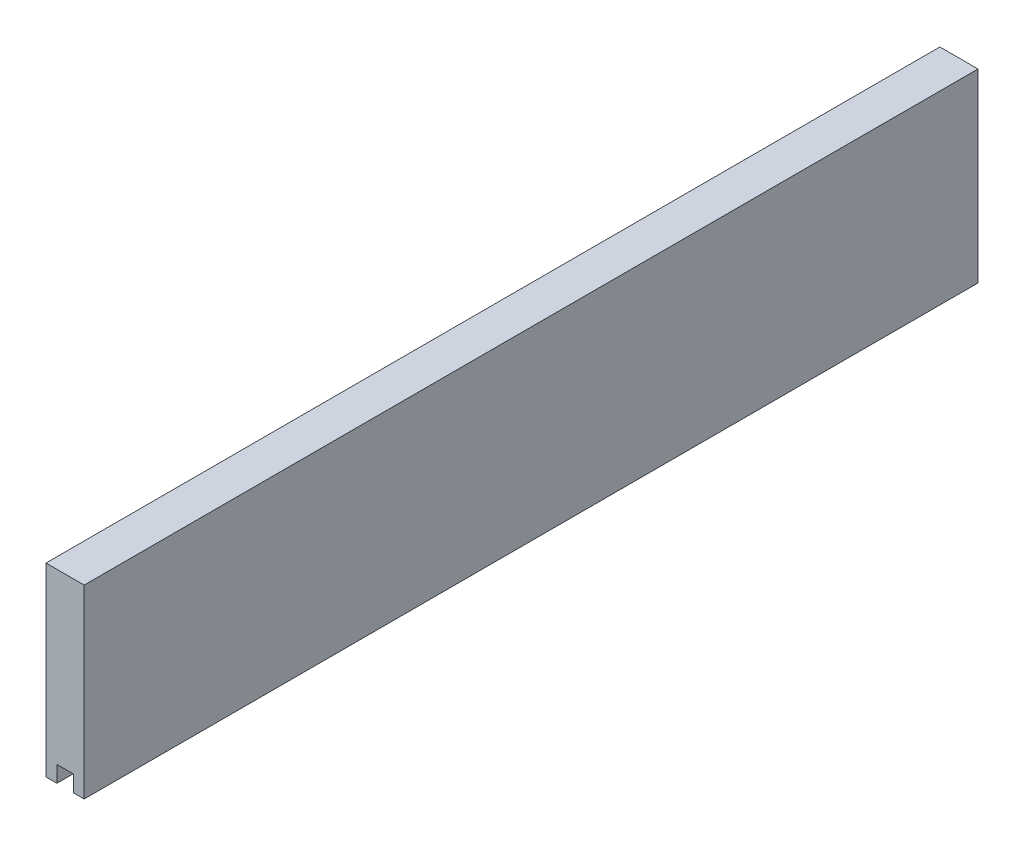
ISO-10303-21;
HEADER;
FILE_DESCRIPTION(('STEP AP214'),'2;1');
FILE_NAME('part.step','',(''),(''),'','','');
FILE_SCHEMA(('AUTOMOTIVE_DESIGN { 1 0 10303 214 1 1 1 1 }'));
ENDSEC;
DATA;
#1=APPLICATION_CONTEXT('core data for automotive mechanical design processes');
#2=APPLICATION_PROTOCOL_DEFINITION('international standard','automotive_design',2000,#1);
#3=PRODUCT_CONTEXT('',#1,'mechanical');
#4=PRODUCT('Part','Part','',(#3));
#5=PRODUCT_RELATED_PRODUCT_CATEGORY('part','',(#4));
#6=PRODUCT_DEFINITION_FORMATION('','',#4);
#7=PRODUCT_DEFINITION_CONTEXT('part definition',#1,'design');
#8=PRODUCT_DEFINITION('design','',#6,#7);
#9=PRODUCT_DEFINITION_SHAPE('','',#8);
#10=(LENGTH_UNIT() NAMED_UNIT(*) SI_UNIT(.MILLI.,.METRE.));
#11=(NAMED_UNIT(*) PLANE_ANGLE_UNIT() SI_UNIT($,.RADIAN.));
#12=(NAMED_UNIT(*) SI_UNIT($,.STERADIAN.) SOLID_ANGLE_UNIT());
#13=UNCERTAINTY_MEASURE_WITH_UNIT(LENGTH_MEASURE(1.E-05),#10,'distance_accuracy_value','');
#14=(GEOMETRIC_REPRESENTATION_CONTEXT(3) GLOBAL_UNCERTAINTY_ASSIGNED_CONTEXT((#13)) GLOBAL_UNIT_ASSIGNED_CONTEXT((#10,
#11,#12)) REPRESENTATION_CONTEXT('',''));
#15=CARTESIAN_POINT('',(0.,0.,0.));
#16=DIRECTION('',(0.,0.,1.));
#17=DIRECTION('',(1.,0.,0.));
#18=AXIS2_PLACEMENT_3D('',#15,#16,#17);
#19=CARTESIAN_POINT('',(10.,0.,-820.));
#20=DIRECTION('',(0.,-1.,0.));
#21=DIRECTION('',(1.,0.,0.));
#22=AXIS2_PLACEMENT_3D('',#19,#20,#21);
#23=PLANE('',#22);
#24=DIRECTION('',(1.,0.,0.));
#25=VECTOR('',#24,1.);
#26=CARTESIAN_POINT('',(10.,0.,0.));
#27=LINE('',#26,#25);
#28=CARTESIAN_POINT('',(0.,0.,0.));
#29=VERTEX_POINT('',#28);
#30=CARTESIAN_POINT('',(10.,0.,0.));
#31=VERTEX_POINT('',#30);
#32=EDGE_CURVE('E132',#29,#31,#27,.T.);
#33=ORIENTED_EDGE('',*,*,#32,.F.);
#34=DIRECTION('',(0.,0.,1.));
#35=VECTOR('',#34,1.);
#36=CARTESIAN_POINT('',(0.,0.,-820.));
#37=LINE('',#36,#35);
#38=CARTESIAN_POINT('',(0.,0.,-820.));
#39=VERTEX_POINT('',#38);
#40=EDGE_CURVE('E11',#39,#29,#37,.T.);
#41=ORIENTED_EDGE('',*,*,#40,.F.);
#42=DIRECTION('',(1.,0.,0.));
#43=VECTOR('',#42,1.);
#44=CARTESIAN_POINT('',(10.,0.,-820.));
#45=LINE('',#44,#43);
#46=CARTESIAN_POINT('',(10.,0.,-820.));
#47=VERTEX_POINT('',#46);
#48=EDGE_CURVE('E152',#39,#47,#45,.T.);
#49=ORIENTED_EDGE('',*,*,#48,.T.);
#50=DIRECTION('',(0.,0.,1.));
#51=VECTOR('',#50,1.);
#52=CARTESIAN_POINT('',(10.,0.,-820.));
#53=LINE('',#52,#51);
#54=EDGE_CURVE('E38',#47,#31,#53,.T.);
#55=ORIENTED_EDGE('',*,*,#54,.T.);
#56=EDGE_LOOP('',(#33,#41,#49,#55));
#57=FACE_BOUND('',#56,.T.);
#58=ADVANCED_FACE('F35',(#57),#23,.T.);
#59=CARTESIAN_POINT('',(0.,0.,-820.));
#60=DIRECTION('',(-1.,0.,0.));
#61=DIRECTION('',(0.,0.,1.));
#62=AXIS2_PLACEMENT_3D('',#59,#60,#61);
#63=PLANE('',#62);
#64=DIRECTION('',(0.,-1.,0.));
#65=VECTOR('',#64,1.);
#66=CARTESIAN_POINT('',(0.,0.,0.));
#67=LINE('',#66,#65);
#68=CARTESIAN_POINT('',(0.,170.,0.));
#69=VERTEX_POINT('',#68);
#70=EDGE_CURVE('E150',#69,#29,#67,.T.);
#71=ORIENTED_EDGE('',*,*,#70,.F.);
#72=DIRECTION('',(0.,0.,1.));
#73=VECTOR('',#72,1.);
#74=CARTESIAN_POINT('',(0.,170.,-820.));
#75=LINE('',#74,#73);
#76=CARTESIAN_POINT('',(0.,170.,-820.));
#77=VERTEX_POINT('',#76);
#78=EDGE_CURVE('E44',#77,#69,#75,.T.);
#79=ORIENTED_EDGE('',*,*,#78,.F.);
#80=DIRECTION('',(0.,-1.,0.));
#81=VECTOR('',#80,1.);
#82=CARTESIAN_POINT('',(0.,0.,-820.));
#83=LINE('',#82,#81);
#84=EDGE_CURVE('E122',#77,#39,#83,.T.);
#85=ORIENTED_EDGE('',*,*,#84,.T.);
#86=ORIENTED_EDGE('',*,*,#40,.T.);
#87=EDGE_LOOP('',(#71,#79,#85,#86));
#88=FACE_BOUND('',#87,.T.);
#89=ADVANCED_FACE('F164',(#88),#63,.T.);
#90=CARTESIAN_POINT('',(0.,170.,-820.));
#91=DIRECTION('',(0.,1.,0.));
#92=DIRECTION('',(0.,0.,1.));
#93=AXIS2_PLACEMENT_3D('',#90,#91,#92);
#94=PLANE('',#93);
#95=DIRECTION('',(-1.,0.,0.));
#96=VECTOR('',#95,1.);
#97=CARTESIAN_POINT('',(0.,170.,0.));
#98=LINE('',#97,#96);
#99=CARTESIAN_POINT('',(35.,170.,0.));
#100=VERTEX_POINT('',#99);
#101=EDGE_CURVE('E109',#100,#69,#98,.T.);
#102=ORIENTED_EDGE('',*,*,#101,.F.);
#103=DIRECTION('',(0.,0.,1.));
#104=VECTOR('',#103,1.);
#105=CARTESIAN_POINT('',(35.,170.,-820.));
#106=LINE('',#105,#104);
#107=CARTESIAN_POINT('',(35.,170.,-820.));
#108=VERTEX_POINT('',#107);
#109=EDGE_CURVE('E104',#108,#100,#106,.T.);
#110=ORIENTED_EDGE('',*,*,#109,.F.);
#111=DIRECTION('',(-1.,0.,0.));
#112=VECTOR('',#111,1.);
#113=CARTESIAN_POINT('',(0.,170.,-820.));
#114=LINE('',#113,#112);
#115=EDGE_CURVE('E107',#108,#77,#114,.T.);
#116=ORIENTED_EDGE('',*,*,#115,.T.);
#117=ORIENTED_EDGE('',*,*,#78,.T.);
#118=EDGE_LOOP('',(#102,#110,#116,#117));
#119=FACE_BOUND('',#118,.T.);
#120=ADVANCED_FACE('F106',(#119),#94,.T.);
#121=CARTESIAN_POINT('',(35.,170.,-820.));
#122=DIRECTION('',(1.,0.,0.));
#123=DIRECTION('',(0.,1.,0.));
#124=AXIS2_PLACEMENT_3D('',#121,#122,#123);
#125=PLANE('',#124);
#126=DIRECTION('',(0.,1.,0.));
#127=VECTOR('',#126,1.);
#128=CARTESIAN_POINT('',(35.,170.,0.));
#129=LINE('',#128,#127);
#130=CARTESIAN_POINT('',(35.,0.,0.));
#131=VERTEX_POINT('',#130);
#132=EDGE_CURVE('E147',#131,#100,#129,.T.);
#133=ORIENTED_EDGE('',*,*,#132,.F.);
#134=DIRECTION('',(0.,0.,1.));
#135=VECTOR('',#134,1.);
#136=CARTESIAN_POINT('',(35.,0.,-820.));
#137=LINE('',#136,#135);
#138=CARTESIAN_POINT('',(35.,0.,-820.));
#139=VERTEX_POINT('',#138);
#140=EDGE_CURVE('E114',#139,#131,#137,.T.);
#141=ORIENTED_EDGE('',*,*,#140,.F.);
#142=DIRECTION('',(0.,1.,0.));
#143=VECTOR('',#142,1.);
#144=CARTESIAN_POINT('',(35.,170.,-820.));
#145=LINE('',#144,#143);
#146=EDGE_CURVE('E120',#139,#108,#145,.T.);
#147=ORIENTED_EDGE('',*,*,#146,.T.);
#148=ORIENTED_EDGE('',*,*,#109,.T.);
#149=EDGE_LOOP('',(#133,#141,#147,#148));
#150=FACE_BOUND('',#149,.T.);
#151=ADVANCED_FACE('F124',(#150),#125,.T.);
#152=CARTESIAN_POINT('',(35.,0.,-820.));
#153=DIRECTION('',(0.,-1.,0.));
#154=DIRECTION('',(1.,0.,0.));
#155=AXIS2_PLACEMENT_3D('',#152,#153,#154);
#156=PLANE('',#155);
#157=DIRECTION('',(1.,0.,0.));
#158=VECTOR('',#157,1.);
#159=CARTESIAN_POINT('',(35.,0.,0.));
#160=LINE('',#159,#158);
#161=CARTESIAN_POINT('',(25.,0.,0.));
#162=VERTEX_POINT('',#161);
#163=EDGE_CURVE('E144',#162,#131,#160,.T.);
#164=ORIENTED_EDGE('',*,*,#163,.F.);
#165=DIRECTION('',(0.,0.,1.));
#166=VECTOR('',#165,1.);
#167=CARTESIAN_POINT('',(25.,0.,-820.));
#168=LINE('',#167,#166);
#169=CARTESIAN_POINT('',(25.,0.,-820.));
#170=VERTEX_POINT('',#169);
#171=EDGE_CURVE('E156',#170,#162,#168,.T.);
#172=ORIENTED_EDGE('',*,*,#171,.F.);
#173=DIRECTION('',(1.,0.,0.));
#174=VECTOR('',#173,1.);
#175=CARTESIAN_POINT('',(35.,0.,-820.));
#176=LINE('',#175,#174);
#177=EDGE_CURVE('E125',#170,#139,#176,.T.);
#178=ORIENTED_EDGE('',*,*,#177,.T.);
#179=ORIENTED_EDGE('',*,*,#140,.T.);
#180=EDGE_LOOP('',(#164,#172,#178,#179));
#181=FACE_BOUND('',#180,.T.);
#182=ADVANCED_FACE('F177',(#181),#156,.T.);
#183=CARTESIAN_POINT('',(25.,0.,-820.));
#184=DIRECTION('',(-1.,0.,0.));
#185=DIRECTION('',(0.,0.,1.));
#186=AXIS2_PLACEMENT_3D('',#183,#184,#185);
#187=PLANE('',#186);
#188=DIRECTION('',(0.,-1.,0.));
#189=VECTOR('',#188,1.);
#190=CARTESIAN_POINT('',(25.,0.,0.));
#191=LINE('',#190,#189);
#192=CARTESIAN_POINT('',(25.,15.,0.));
#193=VERTEX_POINT('',#192);
#194=EDGE_CURVE('E141',#193,#162,#191,.T.);
#195=ORIENTED_EDGE('',*,*,#194,.F.);
#196=DIRECTION('',(0.,0.,1.));
#197=VECTOR('',#196,1.);
#198=CARTESIAN_POINT('',(25.,15.,-820.));
#199=LINE('',#198,#197);
#200=CARTESIAN_POINT('',(25.,15.,-820.));
#201=VERTEX_POINT('',#200);
#202=EDGE_CURVE('E158',#201,#193,#199,.T.);
#203=ORIENTED_EDGE('',*,*,#202,.F.);
#204=DIRECTION('',(0.,-1.,0.));
#205=VECTOR('',#204,1.);
#206=CARTESIAN_POINT('',(25.,0.,-820.));
#207=LINE('',#206,#205);
#208=EDGE_CURVE('E127',#201,#170,#207,.T.);
#209=ORIENTED_EDGE('',*,*,#208,.T.);
#210=ORIENTED_EDGE('',*,*,#171,.T.);
#211=EDGE_LOOP('',(#195,#203,#209,#210));
#212=FACE_BOUND('',#211,.T.);
#213=ADVANCED_FACE('F180',(#212),#187,.T.);
#214=CARTESIAN_POINT('',(25.,15.,-820.));
#215=DIRECTION('',(0.,-1.,0.));
#216=DIRECTION('',(1.,0.,0.));
#217=AXIS2_PLACEMENT_3D('',#214,#215,#216);
#218=PLANE('',#217);
#219=DIRECTION('',(1.,0.,0.));
#220=VECTOR('',#219,1.);
#221=CARTESIAN_POINT('',(25.,15.,0.));
#222=LINE('',#221,#220);
#223=CARTESIAN_POINT('',(10.,15.,0.));
#224=VERTEX_POINT('',#223);
#225=EDGE_CURVE('E138',#224,#193,#222,.T.);
#226=ORIENTED_EDGE('',*,*,#225,.F.);
#227=DIRECTION('',(0.,0.,1.));
#228=VECTOR('',#227,1.);
#229=CARTESIAN_POINT('',(10.,15.,-820.));
#230=LINE('',#229,#228);
#231=CARTESIAN_POINT('',(10.,15.,-820.));
#232=VERTEX_POINT('',#231);
#233=EDGE_CURVE('E159',#232,#224,#230,.T.);
#234=ORIENTED_EDGE('',*,*,#233,.F.);
#235=DIRECTION('',(1.,0.,0.));
#236=VECTOR('',#235,1.);
#237=CARTESIAN_POINT('',(25.,15.,-820.));
#238=LINE('',#237,#236);
#239=EDGE_CURVE('E255',#232,#201,#238,.T.);
#240=ORIENTED_EDGE('',*,*,#239,.T.);
#241=ORIENTED_EDGE('',*,*,#202,.T.);
#242=EDGE_LOOP('',(#226,#234,#240,#241));
#243=FACE_BOUND('',#242,.T.);
#244=ADVANCED_FACE('F184',(#243),#218,.T.);
#245=CARTESIAN_POINT('',(10.,15.,-820.));
#246=DIRECTION('',(1.,0.,0.));
#247=DIRECTION('',(0.,1.,0.));
#248=AXIS2_PLACEMENT_3D('',#245,#246,#247);
#249=PLANE('',#248);
#250=DIRECTION('',(0.,1.,0.));
#251=VECTOR('',#250,1.);
#252=CARTESIAN_POINT('',(10.,15.,0.));
#253=LINE('',#252,#251);
#254=EDGE_CURVE('E135',#31,#224,#253,.T.);
#255=ORIENTED_EDGE('',*,*,#254,.F.);
#256=ORIENTED_EDGE('',*,*,#54,.F.);
#257=DIRECTION('',(0.,1.,0.));
#258=VECTOR('',#257,1.);
#259=CARTESIAN_POINT('',(10.,15.,-820.));
#260=LINE('',#259,#258);
#261=EDGE_CURVE('E256',#47,#232,#260,.T.);
#262=ORIENTED_EDGE('',*,*,#261,.T.);
#263=ORIENTED_EDGE('',*,*,#233,.T.);
#264=EDGE_LOOP('',(#255,#256,#262,#263));
#265=FACE_BOUND('',#264,.T.);
#266=ADVANCED_FACE('F161',(#265),#249,.T.);
#267=CARTESIAN_POINT('',(0.,0.,-820.));
#268=DIRECTION('',(0.,0.,-1.));
#269=DIRECTION('',(-1.,0.,0.));
#270=AXIS2_PLACEMENT_3D('',#267,#268,#269);
#271=PLANE('',#270);
#272=ORIENTED_EDGE('',*,*,#48,.F.);
#273=ORIENTED_EDGE('',*,*,#84,.F.);
#274=ORIENTED_EDGE('',*,*,#115,.F.);
#275=ORIENTED_EDGE('',*,*,#146,.F.);
#276=ORIENTED_EDGE('',*,*,#177,.F.);
#277=ORIENTED_EDGE('',*,*,#208,.F.);
#278=ORIENTED_EDGE('',*,*,#239,.F.);
#279=ORIENTED_EDGE('',*,*,#261,.F.);
#280=EDGE_LOOP('',(#272,#273,#274,#275,#276,#277,#278,#279));
#281=FACE_BOUND('',#280,.T.);
#282=ADVANCED_FACE('F118',(#281),#271,.T.);
#283=CARTESIAN_POINT('',(0.,0.,0.));
#284=DIRECTION('',(0.,0.,-1.));
#285=DIRECTION('',(-1.,0.,0.));
#286=AXIS2_PLACEMENT_3D('',#283,#284,#285);
#287=PLANE('',#286);
#288=ORIENTED_EDGE('',*,*,#32,.T.);
#289=ORIENTED_EDGE('',*,*,#254,.T.);
#290=ORIENTED_EDGE('',*,*,#225,.T.);
#291=ORIENTED_EDGE('',*,*,#194,.T.);
#292=ORIENTED_EDGE('',*,*,#163,.T.);
#293=ORIENTED_EDGE('',*,*,#132,.T.);
#294=ORIENTED_EDGE('',*,*,#101,.T.);
#295=ORIENTED_EDGE('',*,*,#70,.T.);
#296=EDGE_LOOP('',(#288,#289,#290,#291,#292,#293,#294,#295));
#297=FACE_BOUND('',#296,.T.);
#298=ADVANCED_FACE('F163',(#297),#287,.F.);
#299=CLOSED_SHELL('',(#58,#89,#120,#151,#182,#213,#244,#266,#282,#298));
#300=MANIFOLD_SOLID_BREP('B2',#299);
#301=ADVANCED_BREP_SHAPE_REPRESENTATION('',(#18,#300),#14);
#302=SHAPE_DEFINITION_REPRESENTATION(#9,#301);
ENDSEC;
END-ISO-10303-21;
